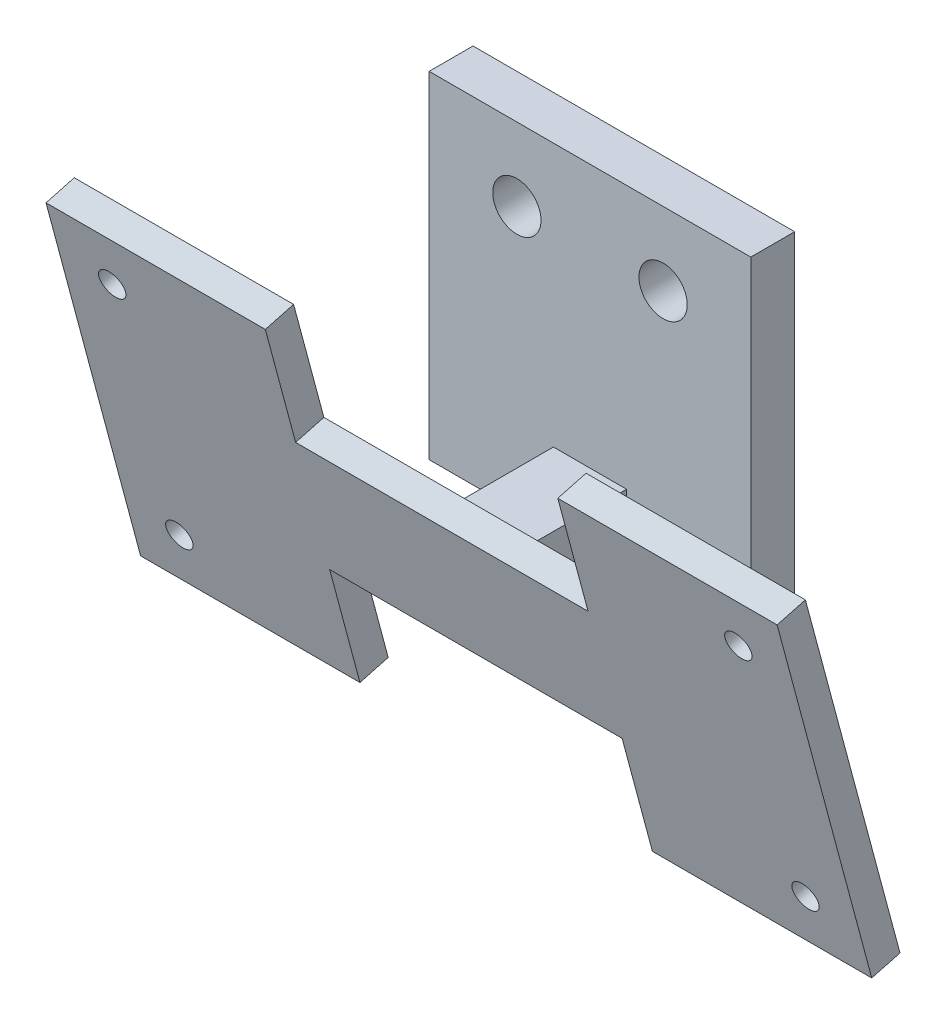
ISO-10303-21;
HEADER;
FILE_DESCRIPTION(('STEP AP214'),'2;1');
FILE_NAME('part.step','',(''),(''),'','','');
FILE_SCHEMA(('AUTOMOTIVE_DESIGN { 1 0 10303 214 1 1 1 1 }'));
ENDSEC;
DATA;
#1=APPLICATION_CONTEXT('core data for automotive mechanical design processes');
#2=APPLICATION_PROTOCOL_DEFINITION('international standard','automotive_design',2000,#1);
#3=PRODUCT_CONTEXT('',#1,'mechanical');
#4=PRODUCT('Part','Part','',(#3));
#5=PRODUCT_RELATED_PRODUCT_CATEGORY('part','',(#4));
#6=PRODUCT_DEFINITION_FORMATION('','',#4);
#7=PRODUCT_DEFINITION_CONTEXT('part definition',#1,'design');
#8=PRODUCT_DEFINITION('design','',#6,#7);
#9=PRODUCT_DEFINITION_SHAPE('','',#8);
#10=(LENGTH_UNIT() NAMED_UNIT(*) SI_UNIT(.MILLI.,.METRE.));
#11=(NAMED_UNIT(*) PLANE_ANGLE_UNIT() SI_UNIT($,.RADIAN.));
#12=(NAMED_UNIT(*) SI_UNIT($,.STERADIAN.) SOLID_ANGLE_UNIT());
#13=UNCERTAINTY_MEASURE_WITH_UNIT(LENGTH_MEASURE(1.E-05),#10,'distance_accuracy_value','');
#14=(GEOMETRIC_REPRESENTATION_CONTEXT(3) GLOBAL_UNCERTAINTY_ASSIGNED_CONTEXT((#13)) GLOBAL_UNIT_ASSIGNED_CONTEXT((#10,
#11,#12)) REPRESENTATION_CONTEXT('',''));
#15=CARTESIAN_POINT('',(0.,0.,0.));
#16=DIRECTION('',(0.,0.,1.));
#17=DIRECTION('',(1.,0.,0.));
#18=AXIS2_PLACEMENT_3D('',#15,#16,#17);
#19=CARTESIAN_POINT('',(-25.,-27.3152537835109,6.7988361099295));
#20=DIRECTION('',(0.,0.96592582628907,0.258819045102513));
#21=DIRECTION('',(0.,-0.258819045102513,0.965925826289071));
#22=AXIS2_PLACEMENT_3D('',#19,#20,#21);
#23=PLANE('',#22);
#24=DIRECTION('',(1.,0.,0.));
#25=VECTOR('',#24,1.);
#26=CARTESIAN_POINT('',(-25.,-27.3152537835109,6.7988361099295));
#27=LINE('',#26,#25);
#28=CARTESIAN_POINT('',(-25.,-27.3152537835109,6.7988361099295));
#29=VERTEX_POINT('',#28);
#30=CARTESIAN_POINT('',(-10.,-27.3152537835109,6.7988361099295));
#31=VERTEX_POINT('',#30);
#32=EDGE_CURVE('E202',#29,#31,#27,.T.);
#33=ORIENTED_EDGE('',*,*,#32,.T.);
#34=DIRECTION('',(0.,-0.258819045102515,0.96592582628907));
#35=VECTOR('',#34,1.);
#36=CARTESIAN_POINT('',(-10.,-26.5387966482033,3.90105863106228));
#37=LINE('',#36,#35);
#38=CARTESIAN_POINT('',(-10.,-27.8328918737159,8.73068776250763));
#39=VERTEX_POINT('',#38);
#40=EDGE_CURVE('E185',#31,#39,#37,.T.);
#41=ORIENTED_EDGE('',*,*,#40,.T.);
#42=DIRECTION('',(1.,0.,0.));
#43=VECTOR('',#42,1.);
#44=CARTESIAN_POINT('',(-25.,-27.8328918737159,8.73068776250763));
#45=LINE('',#44,#43);
#46=CARTESIAN_POINT('',(-25.,-27.8328918737159,8.73068776250763));
#47=VERTEX_POINT('',#46);
#48=EDGE_CURVE('E200',#47,#39,#45,.T.);
#49=ORIENTED_EDGE('',*,*,#48,.F.);
#50=DIRECTION('',(0.,-0.258819045102513,0.96592582628907));
#51=VECTOR('',#50,1.);
#52=CARTESIAN_POINT('',(-25.,-27.3152537835109,6.7988361099295));
#53=LINE('',#52,#51);
#54=EDGE_CURVE('E405',#29,#47,#53,.T.);
#55=ORIENTED_EDGE('',*,*,#54,.F.);
#56=EDGE_LOOP('',(#33,#41,#49,#55));
#57=FACE_BOUND('',#56,.T.);
#58=ADVANCED_FACE('F45',(#57),#23,.F.);
#59=CARTESIAN_POINT('',(-25.,-3.1671081262841,13.2693122374924));
#60=DIRECTION('',(0.,-0.96592582628907,-0.258819045102515));
#61=DIRECTION('',(0.,0.258819045102515,-0.96592582628907));
#62=AXIS2_PLACEMENT_3D('',#59,#60,#61);
#63=PLANE('',#62);
#64=DIRECTION('',(1.,0.,0.));
#65=VECTOR('',#64,1.);
#66=CARTESIAN_POINT('',(-25.,-3.68474621648913,15.2011638900705));
#67=LINE('',#66,#65);
#68=CARTESIAN_POINT('',(-25.,-3.68474621648913,15.2011638900705));
#69=VERTEX_POINT('',#68);
#70=CARTESIAN_POINT('',(-10.,-3.68474621648913,15.2011638900705));
#71=VERTEX_POINT('',#70);
#72=EDGE_CURVE('E220',#69,#71,#67,.T.);
#73=ORIENTED_EDGE('',*,*,#72,.T.);
#74=DIRECTION('',(0.,-0.258819045102515,0.96592582628907));
#75=VECTOR('',#74,1.);
#76=CARTESIAN_POINT('',(-10.,-2.39065099097656,10.3715347586252));
#77=LINE('',#76,#75);
#78=CARTESIAN_POINT('',(-10.,-3.1671081262841,13.2693122374924));
#79=VERTEX_POINT('',#78);
#80=EDGE_CURVE('E380',#79,#71,#77,.T.);
#81=ORIENTED_EDGE('',*,*,#80,.F.);
#82=DIRECTION('',(1.,0.,0.));
#83=VECTOR('',#82,1.);
#84=CARTESIAN_POINT('',(-25.,-3.1671081262841,13.2693122374924));
#85=LINE('',#84,#83);
#86=CARTESIAN_POINT('',(-25.,-3.1671081262841,13.2693122374924));
#87=VERTEX_POINT('',#86);
#88=EDGE_CURVE('E434',#87,#79,#85,.T.);
#89=ORIENTED_EDGE('',*,*,#88,.F.);
#90=DIRECTION('',(0.,0.258819045102515,-0.96592582628907));
#91=VECTOR('',#90,1.);
#92=CARTESIAN_POINT('',(-25.,-3.1671081262841,13.2693122374924));
#93=LINE('',#92,#91);
#94=EDGE_CURVE('E411',#69,#87,#93,.T.);
#95=ORIENTED_EDGE('',*,*,#94,.F.);
#96=EDGE_LOOP('',(#73,#81,#89,#95));
#97=FACE_BOUND('',#96,.T.);
#98=ADVANCED_FACE('F475',(#97),#63,.F.);
#99=CARTESIAN_POINT('',(0.,-18.,0.));
#100=DIRECTION('',(0.,-1.,0.));
#101=DIRECTION('',(0.,0.,-1.));
#102=AXIS2_PLACEMENT_3D('',#99,#100,#101);
#103=PLANE('',#102);
#104=DIRECTION('',(0.,0.,-1.));
#105=VECTOR('',#104,1.);
#106=CARTESIAN_POINT('',(2.5,-18.,11.));
#107=LINE('',#106,#105);
#108=CARTESIAN_POINT('',(2.5,-18.,9.29485083851213));
#109=VERTEX_POINT('',#108);
#110=CARTESIAN_POINT('',(2.5,-18.,3.));
#111=VERTEX_POINT('',#110);
#112=EDGE_CURVE('E243',#109,#111,#107,.T.);
#113=ORIENTED_EDGE('',*,*,#112,.F.);
#114=DIRECTION('',(-1.,0.,0.));
#115=VECTOR('',#114,1.);
#116=CARTESIAN_POINT('',(0.,-18.,9.29485083851213));
#117=LINE('',#116,#115);
#118=CARTESIAN_POINT('',(-2.5,-18.,9.29485083851213));
#119=VERTEX_POINT('',#118);
#120=EDGE_CURVE('E227',#109,#119,#117,.T.);
#121=ORIENTED_EDGE('',*,*,#120,.T.);
#122=DIRECTION('',(0.,0.,-1.));
#123=VECTOR('',#122,1.);
#124=CARTESIAN_POINT('',(-2.5,-18.,11.));
#125=LINE('',#124,#123);
#126=CARTESIAN_POINT('',(-2.5,-18.,3.));
#127=VERTEX_POINT('',#126);
#128=EDGE_CURVE('E246',#119,#127,#125,.T.);
#129=ORIENTED_EDGE('',*,*,#128,.T.);
#130=DIRECTION('',(-1.,0.,0.));
#131=VECTOR('',#130,1.);
#132=CARTESIAN_POINT('',(-11.,-18.,3.));
#133=LINE('',#132,#131);
#134=CARTESIAN_POINT('',(-11.,-18.,3.));
#135=VERTEX_POINT('',#134);
#136=EDGE_CURVE('E267',#127,#135,#133,.T.);
#137=ORIENTED_EDGE('',*,*,#136,.T.);
#138=DIRECTION('',(0.,0.,-1.));
#139=VECTOR('',#138,1.);
#140=CARTESIAN_POINT('',(-11.,-18.,3.));
#141=LINE('',#140,#139);
#142=CARTESIAN_POINT('',(-11.,-18.,0.));
#143=VERTEX_POINT('',#142);
#144=EDGE_CURVE('E255',#135,#143,#141,.T.);
#145=ORIENTED_EDGE('',*,*,#144,.T.);
#146=DIRECTION('',(1.,0.,0.));
#147=VECTOR('',#146,1.);
#148=CARTESIAN_POINT('',(-11.,-18.,0.));
#149=LINE('',#148,#147);
#150=CARTESIAN_POINT('',(11.,-18.,0.));
#151=VERTEX_POINT('',#150);
#152=EDGE_CURVE('E259',#143,#151,#149,.T.);
#153=ORIENTED_EDGE('',*,*,#152,.T.);
#154=DIRECTION('',(0.,0.,1.));
#155=VECTOR('',#154,1.);
#156=CARTESIAN_POINT('',(11.,-18.,3.));
#157=LINE('',#156,#155);
#158=CARTESIAN_POINT('',(11.,-18.,3.));
#159=VERTEX_POINT('',#158);
#160=EDGE_CURVE('E263',#151,#159,#157,.T.);
#161=ORIENTED_EDGE('',*,*,#160,.T.);
#162=EDGE_CURVE('E268',#159,#111,#133,.T.);
#163=ORIENTED_EDGE('',*,*,#162,.T.);
#164=EDGE_LOOP('',(#113,#121,#129,#137,#145,#153,#161,#163));
#165=FACE_BOUND('',#164,.T.);
#166=ADVANCED_FACE('F497',(#165),#103,.T.);
#167=CARTESIAN_POINT('',(2.5,-13.,11.));
#168=DIRECTION('',(-1.,0.,0.));
#169=DIRECTION('',(0.,-1.,0.));
#170=AXIS2_PLACEMENT_3D('',#167,#168,#169);
#171=PLANE('',#170);
#172=DIRECTION('',(0.,0.96592582628907,0.258819045102515));
#173=VECTOR('',#172,1.);
#174=CARTESIAN_POINT('',(2.5,-12.9086492001669,10.6590741737109));
#175=LINE('',#174,#173);
#176=CARTESIAN_POINT('',(2.5,-13.,10.6345968006677));
#177=VERTEX_POINT('',#176);
#178=EDGE_CURVE('E218',#109,#177,#175,.T.);
#179=ORIENTED_EDGE('',*,*,#178,.F.);
#180=ORIENTED_EDGE('',*,*,#112,.T.);
#181=DIRECTION('',(0.,1.,0.));
#182=VECTOR('',#181,1.);
#183=CARTESIAN_POINT('',(2.5,-13.,3.));
#184=LINE('',#183,#182);
#185=CARTESIAN_POINT('',(2.5,-13.,3.));
#186=VERTEX_POINT('',#185);
#187=EDGE_CURVE('E231',#111,#186,#184,.T.);
#188=ORIENTED_EDGE('',*,*,#187,.T.);
#189=DIRECTION('',(0.,0.,-1.));
#190=VECTOR('',#189,1.);
#191=CARTESIAN_POINT('',(2.5,-13.,11.));
#192=LINE('',#191,#190);
#193=EDGE_CURVE('E252',#177,#186,#192,.T.);
#194=ORIENTED_EDGE('',*,*,#193,.F.);
#195=EDGE_LOOP('',(#179,#180,#188,#194));
#196=FACE_BOUND('',#195,.T.);
#197=ADVANCED_FACE('F565',(#196),#171,.F.);
#198=CARTESIAN_POINT('',(-2.5,-13.,11.));
#199=DIRECTION('',(0.,-1.,0.));
#200=DIRECTION('',(0.,0.,-1.));
#201=AXIS2_PLACEMENT_3D('',#198,#199,#200);
#202=PLANE('',#201);
#203=DIRECTION('',(-1.,0.,0.));
#204=VECTOR('',#203,1.);
#205=CARTESIAN_POINT('',(-2.5,-13.,10.6345968006677));
#206=LINE('',#205,#204);
#207=CARTESIAN_POINT('',(-2.5,-13.,10.6345968006677));
#208=VERTEX_POINT('',#207);
#209=EDGE_CURVE('E212',#177,#208,#206,.T.);
#210=ORIENTED_EDGE('',*,*,#209,.F.);
#211=ORIENTED_EDGE('',*,*,#193,.T.);
#212=DIRECTION('',(-1.,0.,0.));
#213=VECTOR('',#212,1.);
#214=CARTESIAN_POINT('',(-2.5,-13.,3.));
#215=LINE('',#214,#213);
#216=CARTESIAN_POINT('',(-2.5,-13.,3.));
#217=VERTEX_POINT('',#216);
#218=EDGE_CURVE('E235',#186,#217,#215,.T.);
#219=ORIENTED_EDGE('',*,*,#218,.T.);
#220=DIRECTION('',(0.,0.,-1.));
#221=VECTOR('',#220,1.);
#222=CARTESIAN_POINT('',(-2.5,-13.,11.));
#223=LINE('',#222,#221);
#224=EDGE_CURVE('E249',#208,#217,#223,.T.);
#225=ORIENTED_EDGE('',*,*,#224,.F.);
#226=EDGE_LOOP('',(#210,#211,#219,#225));
#227=FACE_BOUND('',#226,.T.);
#228=ADVANCED_FACE('F562',(#227),#202,.F.);
#229=CARTESIAN_POINT('',(-2.5,-13.,11.));
#230=DIRECTION('',(1.,0.,0.));
#231=DIRECTION('',(0.,0.,-1.));
#232=AXIS2_PLACEMENT_3D('',#229,#230,#231);
#233=PLANE('',#232);
#234=DIRECTION('',(0.,-0.96592582628907,-0.258819045102515));
#235=VECTOR('',#234,1.);
#236=CARTESIAN_POINT('',(-2.5,-12.9086492001669,10.6590741737109));
#237=LINE('',#236,#235);
#238=EDGE_CURVE('E317',#208,#119,#237,.T.);
#239=ORIENTED_EDGE('',*,*,#238,.F.);
#240=ORIENTED_EDGE('',*,*,#224,.T.);
#241=DIRECTION('',(0.,-1.,0.));
#242=VECTOR('',#241,1.);
#243=CARTESIAN_POINT('',(-2.5,-13.,3.));
#244=LINE('',#243,#242);
#245=EDGE_CURVE('E239',#217,#127,#244,.T.);
#246=ORIENTED_EDGE('',*,*,#245,.T.);
#247=ORIENTED_EDGE('',*,*,#128,.F.);
#248=EDGE_LOOP('',(#239,#240,#246,#247));
#249=FACE_BOUND('',#248,.T.);
#250=ADVANCED_FACE('F526',(#249),#233,.F.);
#251=CARTESIAN_POINT('',(0.,0.,3.));
#252=DIRECTION('',(0.,0.,-1.));
#253=DIRECTION('',(-1.,0.,0.));
#254=AXIS2_PLACEMENT_3D('',#251,#252,#253);
#255=PLANE('',#254);
#256=CARTESIAN_POINT('',(5.,0.,3.));
#257=DIRECTION('',(0.,0.,1.));
#258=DIRECTION('',(-1.,0.,0.));
#259=AXIS2_PLACEMENT_3D('',#256,#257,#258);
#260=CIRCLE('',#259,1.65);
#261=CARTESIAN_POINT('',(3.35,0.,3.));
#262=VERTEX_POINT('',#261);
#263=EDGE_CURVE('E273',#262,#262,#260,.T.);
#264=ORIENTED_EDGE('',*,*,#263,.F.);
#265=EDGE_LOOP('',(#264));
#266=FACE_BOUND('',#265,.T.);
#267=CARTESIAN_POINT('',(-5.,0.,3.));
#268=DIRECTION('',(0.,0.,1.));
#269=DIRECTION('',(1.,0.,0.));
#270=AXIS2_PLACEMENT_3D('',#267,#268,#269);
#271=CIRCLE('',#270,1.65);
#272=CARTESIAN_POINT('',(-3.35,0.,3.));
#273=VERTEX_POINT('',#272);
#274=EDGE_CURVE('E281',#273,#273,#271,.T.);
#275=ORIENTED_EDGE('',*,*,#274,.F.);
#276=EDGE_LOOP('',(#275));
#277=FACE_BOUND('',#276,.T.);
#278=ORIENTED_EDGE('',*,*,#187,.F.);
#279=ORIENTED_EDGE('',*,*,#162,.F.);
#280=DIRECTION('',(0.,1.,0.));
#281=VECTOR('',#280,1.);
#282=CARTESIAN_POINT('',(11.,-5.,3.));
#283=LINE('',#282,#281);
#284=CARTESIAN_POINT('',(11.,5.,3.));
#285=VERTEX_POINT('',#284);
#286=EDGE_CURVE('E289',#159,#285,#283,.T.);
#287=ORIENTED_EDGE('',*,*,#286,.T.);
#288=DIRECTION('',(-1.,0.,0.));
#289=VECTOR('',#288,1.);
#290=CARTESIAN_POINT('',(-11.,5.,3.));
#291=LINE('',#290,#289);
#292=CARTESIAN_POINT('',(-11.,5.,3.));
#293=VERTEX_POINT('',#292);
#294=EDGE_CURVE('E293',#285,#293,#291,.T.);
#295=ORIENTED_EDGE('',*,*,#294,.T.);
#296=DIRECTION('',(0.,-1.,0.));
#297=VECTOR('',#296,1.);
#298=CARTESIAN_POINT('',(-11.,-5.,3.));
#299=LINE('',#298,#297);
#300=EDGE_CURVE('E297',#293,#135,#299,.T.);
#301=ORIENTED_EDGE('',*,*,#300,.T.);
#302=ORIENTED_EDGE('',*,*,#136,.F.);
#303=ORIENTED_EDGE('',*,*,#245,.F.);
#304=ORIENTED_EDGE('',*,*,#218,.F.);
#305=EDGE_LOOP('',(#278,#279,#287,#295,#301,#302,#303,#304));
#306=FACE_BOUND('',#305,.T.);
#307=ADVANCED_FACE('F522',(#266,#277,#306),#255,.F.);
#308=CARTESIAN_POINT('',(0.,0.,0.));
#309=DIRECTION('',(0.,0.,-1.));
#310=DIRECTION('',(-1.,0.,0.));
#311=AXIS2_PLACEMENT_3D('',#308,#309,#310);
#312=PLANE('',#311);
#313=CARTESIAN_POINT('',(-5.,0.,0.));
#314=DIRECTION('',(0.,0.,1.));
#315=DIRECTION('',(1.,0.,0.));
#316=AXIS2_PLACEMENT_3D('',#313,#314,#315);
#317=CIRCLE('',#316,1.65);
#318=CARTESIAN_POINT('',(-3.35,0.,0.));
#319=VERTEX_POINT('',#318);
#320=EDGE_CURVE('E277',#319,#319,#317,.T.);
#321=ORIENTED_EDGE('',*,*,#320,.T.);
#322=EDGE_LOOP('',(#321));
#323=FACE_BOUND('',#322,.T.);
#324=DIRECTION('',(0.,1.,0.));
#325=VECTOR('',#324,1.);
#326=CARTESIAN_POINT('',(11.,-5.,0.));
#327=LINE('',#326,#325);
#328=CARTESIAN_POINT('',(11.,5.,0.));
#329=VERTEX_POINT('',#328);
#330=EDGE_CURVE('E285',#151,#329,#327,.T.);
#331=ORIENTED_EDGE('',*,*,#330,.F.);
#332=ORIENTED_EDGE('',*,*,#152,.F.);
#333=DIRECTION('',(0.,-1.,0.));
#334=VECTOR('',#333,1.);
#335=CARTESIAN_POINT('',(-11.,-5.,0.));
#336=LINE('',#335,#334);
#337=CARTESIAN_POINT('',(-11.,5.,0.));
#338=VERTEX_POINT('',#337);
#339=EDGE_CURVE('E294',#338,#143,#336,.T.);
#340=ORIENTED_EDGE('',*,*,#339,.F.);
#341=DIRECTION('',(-1.,0.,0.));
#342=VECTOR('',#341,1.);
#343=CARTESIAN_POINT('',(-11.,5.,0.));
#344=LINE('',#343,#342);
#345=EDGE_CURVE('E305',#329,#338,#344,.T.);
#346=ORIENTED_EDGE('',*,*,#345,.F.);
#347=EDGE_LOOP('',(#331,#332,#340,#346));
#348=FACE_BOUND('',#347,.T.);
#349=CARTESIAN_POINT('',(5.,0.,0.));
#350=DIRECTION('',(0.,0.,1.));
#351=DIRECTION('',(-1.,0.,0.));
#352=AXIS2_PLACEMENT_3D('',#349,#350,#351);
#353=CIRCLE('',#352,1.65);
#354=CARTESIAN_POINT('',(3.35,0.,0.));
#355=VERTEX_POINT('',#354);
#356=EDGE_CURVE('E272',#355,#355,#353,.T.);
#357=ORIENTED_EDGE('',*,*,#356,.T.);
#358=EDGE_LOOP('',(#357));
#359=FACE_BOUND('',#358,.T.);
#360=ADVANCED_FACE('F525',(#323,#348,#359),#312,.T.);
#361=CARTESIAN_POINT('',(11.,-5.,3.));
#362=DIRECTION('',(-1.,0.,0.));
#363=DIRECTION('',(0.,0.,1.));
#364=AXIS2_PLACEMENT_3D('',#361,#362,#363);
#365=PLANE('',#364);
#366=ORIENTED_EDGE('',*,*,#330,.T.);
#367=DIRECTION('',(0.,0.,-1.));
#368=VECTOR('',#367,1.);
#369=CARTESIAN_POINT('',(11.,5.,3.));
#370=LINE('',#369,#368);
#371=EDGE_CURVE('E313',#285,#329,#370,.T.);
#372=ORIENTED_EDGE('',*,*,#371,.F.);
#373=ORIENTED_EDGE('',*,*,#286,.F.);
#374=ORIENTED_EDGE('',*,*,#160,.F.);
#375=EDGE_LOOP('',(#366,#372,#373,#374));
#376=FACE_BOUND('',#375,.T.);
#377=ADVANCED_FACE('F47',(#376),#365,.F.);
#378=CARTESIAN_POINT('',(-11.,5.,3.));
#379=DIRECTION('',(0.,-1.,0.));
#380=DIRECTION('',(0.,0.,-1.));
#381=AXIS2_PLACEMENT_3D('',#378,#379,#380);
#382=PLANE('',#381);
#383=ORIENTED_EDGE('',*,*,#345,.T.);
#384=DIRECTION('',(0.,0.,-1.));
#385=VECTOR('',#384,1.);
#386=CARTESIAN_POINT('',(-11.,5.,3.));
#387=LINE('',#386,#385);
#388=EDGE_CURVE('E301',#293,#338,#387,.T.);
#389=ORIENTED_EDGE('',*,*,#388,.F.);
#390=ORIENTED_EDGE('',*,*,#294,.F.);
#391=ORIENTED_EDGE('',*,*,#371,.T.);
#392=EDGE_LOOP('',(#383,#389,#390,#391));
#393=FACE_BOUND('',#392,.T.);
#394=ADVANCED_FACE('F531',(#393),#382,.F.);
#395=CARTESIAN_POINT('',(-11.,-5.,3.));
#396=DIRECTION('',(1.,0.,0.));
#397=DIRECTION('',(0.,0.,-1.));
#398=AXIS2_PLACEMENT_3D('',#395,#396,#397);
#399=PLANE('',#398);
#400=ORIENTED_EDGE('',*,*,#339,.T.);
#401=ORIENTED_EDGE('',*,*,#144,.F.);
#402=ORIENTED_EDGE('',*,*,#300,.F.);
#403=ORIENTED_EDGE('',*,*,#388,.T.);
#404=EDGE_LOOP('',(#400,#401,#402,#403));
#405=FACE_BOUND('',#404,.T.);
#406=ADVANCED_FACE('F515',(#405),#399,.F.);
#407=CARTESIAN_POINT('',(-5.,0.,3.));
#408=DIRECTION('',(0.,0.,-1.));
#409=DIRECTION('',(-1.,0.,0.));
#410=AXIS2_PLACEMENT_3D('',#407,#408,#409);
#411=CYLINDRICAL_SURFACE('',#410,1.65);
#412=ORIENTED_EDGE('',*,*,#274,.T.);
#413=EDGE_LOOP('',(#412));
#414=FACE_BOUND('',#413,.T.);
#415=ORIENTED_EDGE('',*,*,#320,.F.);
#416=EDGE_LOOP('',(#415));
#417=FACE_BOUND('',#416,.T.);
#418=ADVANCED_FACE('F508',(#414,#417),#411,.F.);
#419=CARTESIAN_POINT('',(5.,0.,3.));
#420=DIRECTION('',(0.,0.,-1.));
#421=DIRECTION('',(-1.,0.,0.));
#422=AXIS2_PLACEMENT_3D('',#419,#420,#421);
#423=CYLINDRICAL_SURFACE('',#422,1.65);
#424=ORIENTED_EDGE('',*,*,#263,.T.);
#425=EDGE_LOOP('',(#424));
#426=FACE_BOUND('',#425,.T.);
#427=ORIENTED_EDGE('',*,*,#356,.F.);
#428=EDGE_LOOP('',(#427));
#429=FACE_BOUND('',#428,.T.);
#430=ADVANCED_FACE('F502',(#426,#429),#423,.F.);
#431=CARTESIAN_POINT('',(10.,-27.8328918737159,8.73068776250763));
#432=VERTEX_POINT('',#431);
#433=CARTESIAN_POINT('',(25.,-27.8328918737159,8.73068776250763));
#434=VERTEX_POINT('',#433);
#435=EDGE_CURVE('E213',#432,#434,#45,.T.);
#436=ORIENTED_EDGE('',*,*,#435,.F.);
#437=DIRECTION('',(0.,-0.258819045102515,0.96592582628907));
#438=VECTOR('',#437,1.);
#439=CARTESIAN_POINT('',(10.,-26.5387966482033,3.90105863106228));
#440=LINE('',#439,#438);
#441=CARTESIAN_POINT('',(10.,-27.3152537835109,6.7988361099295));
#442=VERTEX_POINT('',#441);
#443=EDGE_CURVE('E204',#442,#432,#440,.T.);
#444=ORIENTED_EDGE('',*,*,#443,.F.);
#445=CARTESIAN_POINT('',(25.,-27.3152537835109,6.7988361099295));
#446=VERTEX_POINT('',#445);
#447=EDGE_CURVE('E417',#442,#446,#27,.T.);
#448=ORIENTED_EDGE('',*,*,#447,.T.);
#449=DIRECTION('',(0.,-0.258819045102513,0.96592582628907));
#450=VECTOR('',#449,1.);
#451=CARTESIAN_POINT('',(25.,-27.3152537835109,6.7988361099295));
#452=LINE('',#451,#450);
#453=EDGE_CURVE('E339',#446,#434,#452,.T.);
#454=ORIENTED_EDGE('',*,*,#453,.T.);
#455=EDGE_LOOP('',(#436,#444,#448,#454));
#456=FACE_BOUND('',#455,.T.);
#457=ADVANCED_FACE('F454',(#456),#23,.F.);
#458=CARTESIAN_POINT('',(-25.,-27.8328918737159,8.73068776250763));
#459=DIRECTION('',(0.,0.258819045102515,-0.96592582628907));
#460=DIRECTION('',(0.,0.96592582628907,0.258819045102515));
#461=AXIS2_PLACEMENT_3D('',#458,#459,#460);
#462=PLANE('',#461);
#463=CARTESIAN_POINT('',(-21.41,-24.3265811242866,9.67020089622977));
#464=DIRECTION('',(0.,-0.258819045102515,0.96592582628907));
#465=DIRECTION('',(0.,0.96592582628907,0.258819045102515));
#466=AXIS2_PLACEMENT_3D('',#463,#464,#465);
#467=CIRCLE('',#466,0.910000000000001);
#468=CARTESIAN_POINT('',(-21.41,-23.4475886223635,9.90572622727306));
#469=VERTEX_POINT('',#468);
#470=EDGE_CURVE('E361',#469,#469,#467,.T.);
#471=ORIENTED_EDGE('',*,*,#470,.F.);
#472=EDGE_LOOP('',(#471));
#473=FACE_BOUND('',#472,.T.);
#474=CARTESIAN_POINT('',(21.41,-24.3265811242866,9.67020089622977));
#475=DIRECTION('',(0.,-0.258819045102515,0.96592582628907));
#476=DIRECTION('',(0.,-0.96592582628907,-0.258819045102515));
#477=AXIS2_PLACEMENT_3D('',#474,#475,#476);
#478=CIRCLE('',#477,0.91);
#479=CARTESIAN_POINT('',(21.41,-25.2055736262096,9.43467556518648));
#480=VERTEX_POINT('',#479);
#481=EDGE_CURVE('E366',#480,#480,#478,.T.);
#482=ORIENTED_EDGE('',*,*,#481,.F.);
#483=EDGE_LOOP('',(#482));
#484=FACE_BOUND('',#483,.T.);
#485=CARTESIAN_POINT('',(21.41,-7.19105696591845,14.2616507563484));
#486=DIRECTION('',(0.,-0.258819045102515,0.96592582628907));
#487=DIRECTION('',(0.,0.96592582628907,0.258819045102515));
#488=AXIS2_PLACEMENT_3D('',#485,#486,#487);
#489=CIRCLE('',#488,0.91);
#490=CARTESIAN_POINT('',(21.41,-6.3120644639954,14.4971760873917));
#491=VERTEX_POINT('',#490);
#492=EDGE_CURVE('E395',#491,#491,#489,.T.);
#493=ORIENTED_EDGE('',*,*,#492,.F.);
#494=EDGE_LOOP('',(#493));
#495=FACE_BOUND('',#494,.T.);
#496=CARTESIAN_POINT('',(-21.41,-7.19105696591845,14.2616507563484));
#497=DIRECTION('',(0.,-0.258819045102515,0.96592582628907));
#498=DIRECTION('',(0.,-0.96592582628907,-0.258819045102515));
#499=AXIS2_PLACEMENT_3D('',#496,#497,#498);
#500=CIRCLE('',#499,0.91);
#501=CARTESIAN_POINT('',(-21.41,-8.07004946784151,14.0261254253051));
#502=VERTEX_POINT('',#501);
#503=EDGE_CURVE('E327',#502,#502,#500,.T.);
#504=ORIENTED_EDGE('',*,*,#503,.F.);
#505=EDGE_LOOP('',(#504));
#506=FACE_BOUND('',#505,.T.);
#507=ORIENTED_EDGE('',*,*,#48,.T.);
#508=DIRECTION('',(0.,-0.96592582628907,-0.258819045102515));
#509=VECTOR('',#508,1.);
#510=CARTESIAN_POINT('',(-10.,-20.1054852634033,10.8012401233278));
#511=LINE('',#510,#509);
#512=CARTESIAN_POINT('',(-10.,-20.1054852634033,10.8012401233278));
#513=VERTEX_POINT('',#512);
#514=EDGE_CURVE('E182',#513,#39,#511,.T.);
#515=ORIENTED_EDGE('',*,*,#514,.F.);
#516=DIRECTION('',(-1.,0.,0.));
#517=VECTOR('',#516,1.);
#518=CARTESIAN_POINT('',(-10.,-20.1054852634033,10.8012401233278));
#519=LINE('',#518,#517);
#520=CARTESIAN_POINT('',(10.,-20.1054852634033,10.8012401233278));
#521=VERTEX_POINT('',#520);
#522=EDGE_CURVE('E205',#521,#513,#519,.T.);
#523=ORIENTED_EDGE('',*,*,#522,.F.);
#524=DIRECTION('',(0.,0.96592582628907,0.258819045102515));
#525=VECTOR('',#524,1.);
#526=CARTESIAN_POINT('',(10.,-20.1054852634033,10.8012401233278));
#527=LINE('',#526,#525);
#528=EDGE_CURVE('E193',#432,#521,#527,.T.);
#529=ORIENTED_EDGE('',*,*,#528,.F.);
#530=ORIENTED_EDGE('',*,*,#435,.T.);
#531=DIRECTION('',(0.,0.96592582628907,0.258819045102515));
#532=VECTOR('',#531,1.);
#533=CARTESIAN_POINT('',(25.,-27.8328918737159,8.73068776250763));
#534=LINE('',#533,#532);
#535=CARTESIAN_POINT('',(25.,-3.68474621648913,15.2011638900705));
#536=VERTEX_POINT('',#535);
#537=EDGE_CURVE('E421',#434,#536,#534,.T.);
#538=ORIENTED_EDGE('',*,*,#537,.T.);
#539=CARTESIAN_POINT('',(10.,-3.68474621648913,15.2011638900705));
#540=VERTEX_POINT('',#539);
#541=EDGE_CURVE('E437',#540,#536,#67,.T.);
#542=ORIENTED_EDGE('',*,*,#541,.F.);
#543=DIRECTION('',(0.,0.96592582628907,0.258819045102515));
#544=VECTOR('',#543,1.);
#545=CARTESIAN_POINT('',(10.,-11.4121528268017,13.1306115292504));
#546=LINE('',#545,#544);
#547=CARTESIAN_POINT('',(10.,-11.4121528268017,13.1306115292504));
#548=VERTEX_POINT('',#547);
#549=EDGE_CURVE('E389',#548,#540,#546,.T.);
#550=ORIENTED_EDGE('',*,*,#549,.F.);
#551=DIRECTION('',(1.,0.,0.));
#552=VECTOR('',#551,1.);
#553=CARTESIAN_POINT('',(-10.,-11.4121528268017,13.1306115292504));
#554=LINE('',#553,#552);
#555=CARTESIAN_POINT('',(-10.,-11.4121528268017,13.1306115292504));
#556=VERTEX_POINT('',#555);
#557=EDGE_CURVE('E194',#556,#548,#554,.T.);
#558=ORIENTED_EDGE('',*,*,#557,.F.);
#559=DIRECTION('',(0.,-0.96592582628907,-0.258819045102515));
#560=VECTOR('',#559,1.);
#561=CARTESIAN_POINT('',(-10.,-11.4121528268017,13.1306115292504));
#562=LINE('',#561,#560);
#563=EDGE_CURVE('E377',#71,#556,#562,.T.);
#564=ORIENTED_EDGE('',*,*,#563,.F.);
#565=ORIENTED_EDGE('',*,*,#72,.F.);
#566=DIRECTION('',(0.,0.96592582628907,0.258819045102515));
#567=VECTOR('',#566,1.);
#568=CARTESIAN_POINT('',(-25.,-27.8328918737159,8.73068776250763));
#569=LINE('',#568,#567);
#570=EDGE_CURVE('E209',#47,#69,#569,.T.);
#571=ORIENTED_EDGE('',*,*,#570,.F.);
#572=EDGE_LOOP('',(#507,#515,#523,#529,#530,#538,#542,#550,#558,#564,#565,#571));
#573=FACE_BOUND('',#572,.T.);
#574=ADVANCED_FACE('F207',(#473,#484,#495,#506,#573),#462,.F.);
#575=CARTESIAN_POINT('',(10.,-3.1671081262841,13.2693122374924));
#576=VERTEX_POINT('',#575);
#577=CARTESIAN_POINT('',(25.,-3.1671081262841,13.2693122374924));
#578=VERTEX_POINT('',#577);
#579=EDGE_CURVE('E433',#576,#578,#85,.T.);
#580=ORIENTED_EDGE('',*,*,#579,.F.);
#581=DIRECTION('',(0.,-0.258819045102515,0.96592582628907));
#582=VECTOR('',#581,1.);
#583=CARTESIAN_POINT('',(10.,-2.39065099097656,10.3715347586252));
#584=LINE('',#583,#582);
#585=EDGE_CURVE('E69',#576,#540,#584,.T.);
#586=ORIENTED_EDGE('',*,*,#585,.T.);
#587=ORIENTED_EDGE('',*,*,#541,.T.);
#588=DIRECTION('',(0.,0.258819045102515,-0.96592582628907));
#589=VECTOR('',#588,1.);
#590=CARTESIAN_POINT('',(25.,-3.1671081262841,13.2693122374924));
#591=LINE('',#590,#589);
#592=EDGE_CURVE('E425',#536,#578,#591,.T.);
#593=ORIENTED_EDGE('',*,*,#592,.T.);
#594=EDGE_LOOP('',(#580,#586,#587,#593));
#595=FACE_BOUND('',#594,.T.);
#596=ADVANCED_FACE('F447',(#595),#63,.F.);
#597=CARTESIAN_POINT('',(-25.,-27.3152537835109,6.7988361099295));
#598=DIRECTION('',(0.,-0.258819045102515,0.96592582628907));
#599=DIRECTION('',(0.,-0.96592582628907,-0.258819045102515));
#600=AXIS2_PLACEMENT_3D('',#597,#598,#599);
#601=PLANE('',#600);
#602=CARTESIAN_POINT('',(-21.41,-23.8089430340815,7.73834924365163));
#603=DIRECTION('',(0.,-0.258819045102515,0.96592582628907));
#604=DIRECTION('',(0.,-0.96592582628907,-0.258819045102515));
#605=AXIS2_PLACEMENT_3D('',#602,#603,#604);
#606=CIRCLE('',#605,0.910000000000001);
#607=CARTESIAN_POINT('',(-21.41,-24.6879355360046,7.50282391260834));
#608=VERTEX_POINT('',#607);
#609=EDGE_CURVE('E335',#608,#608,#606,.T.);
#610=ORIENTED_EDGE('',*,*,#609,.T.);
#611=EDGE_LOOP('',(#610));
#612=FACE_BOUND('',#611,.T.);
#613=CARTESIAN_POINT('',(21.41,-23.8089430340815,7.73834924365163));
#614=DIRECTION('',(0.,-0.258819045102515,0.96592582628907));
#615=DIRECTION('',(0.,-0.96592582628907,-0.258819045102515));
#616=AXIS2_PLACEMENT_3D('',#613,#614,#615);
#617=CIRCLE('',#616,0.91);
#618=CARTESIAN_POINT('',(21.41,-24.6879355360046,7.50282391260834));
#619=VERTEX_POINT('',#618);
#620=EDGE_CURVE('E331',#619,#619,#617,.T.);
#621=ORIENTED_EDGE('',*,*,#620,.T.);
#622=EDGE_LOOP('',(#621));
#623=FACE_BOUND('',#622,.T.);
#624=CARTESIAN_POINT('',(21.41,-6.67341887571342,12.3297991037702));
#625=DIRECTION('',(0.,-0.258819045102515,0.96592582628907));
#626=DIRECTION('',(0.,-0.96592582628907,-0.258819045102515));
#627=AXIS2_PLACEMENT_3D('',#624,#625,#626);
#628=CIRCLE('',#627,0.91);
#629=CARTESIAN_POINT('',(21.41,-7.55241137763648,12.0942737727269));
#630=VERTEX_POINT('',#629);
#631=EDGE_CURVE('E326',#630,#630,#628,.T.);
#632=ORIENTED_EDGE('',*,*,#631,.T.);
#633=EDGE_LOOP('',(#632));
#634=FACE_BOUND('',#633,.T.);
#635=CARTESIAN_POINT('',(-21.41,-6.67341887571342,12.3297991037702));
#636=DIRECTION('',(0.,-0.258819045102515,0.96592582628907));
#637=DIRECTION('',(0.,-0.96592582628907,-0.258819045102515));
#638=AXIS2_PLACEMENT_3D('',#635,#636,#637);
#639=CIRCLE('',#638,0.91);
#640=CARTESIAN_POINT('',(-21.41,-7.55241137763648,12.094273772727));
#641=VERTEX_POINT('',#640);
#642=EDGE_CURVE('E322',#641,#641,#639,.T.);
#643=ORIENTED_EDGE('',*,*,#642,.T.);
#644=EDGE_LOOP('',(#643));
#645=FACE_BOUND('',#644,.T.);
#646=ORIENTED_EDGE('',*,*,#120,.F.);
#647=ORIENTED_EDGE('',*,*,#178,.T.);
#648=ORIENTED_EDGE('',*,*,#209,.T.);
#649=ORIENTED_EDGE('',*,*,#238,.T.);
#650=EDGE_LOOP('',(#646,#647,#648,#649));
#651=FACE_BOUND('',#650,.T.);
#652=DIRECTION('',(-1.,0.,0.));
#653=VECTOR('',#652,1.);
#654=CARTESIAN_POINT('',(-25.,-19.5878471731983,8.86938847074962));
#655=LINE('',#654,#653);
#656=CARTESIAN_POINT('',(10.,-19.5878471731983,8.86938847074962));
#657=VERTEX_POINT('',#656);
#658=CARTESIAN_POINT('',(-10.,-19.5878471731983,8.86938847074962));
#659=VERTEX_POINT('',#658);
#660=EDGE_CURVE('E54',#657,#659,#655,.T.);
#661=ORIENTED_EDGE('',*,*,#660,.T.);
#662=DIRECTION('',(0.,-0.96592582628907,-0.258819045102515));
#663=VECTOR('',#662,1.);
#664=CARTESIAN_POINT('',(-10.,-27.3152537835109,6.7988361099295));
#665=LINE('',#664,#663);
#666=EDGE_CURVE('E11',#659,#31,#665,.T.);
#667=ORIENTED_EDGE('',*,*,#666,.T.);
#668=ORIENTED_EDGE('',*,*,#32,.F.);
#669=DIRECTION('',(0.,-0.96592582628907,-0.258819045102515));
#670=VECTOR('',#669,1.);
#671=CARTESIAN_POINT('',(-25.,-27.3152537835109,6.7988361099295));
#672=LINE('',#671,#670);
#673=EDGE_CURVE('E414',#87,#29,#672,.T.);
#674=ORIENTED_EDGE('',*,*,#673,.F.);
#675=ORIENTED_EDGE('',*,*,#88,.T.);
#676=DIRECTION('',(0.,-0.96592582628907,-0.258819045102515));
#677=VECTOR('',#676,1.);
#678=CARTESIAN_POINT('',(-10.,-27.3152537835109,6.7988361099295));
#679=LINE('',#678,#677);
#680=CARTESIAN_POINT('',(-10.,-10.8945147365967,11.1987598766722));
#681=VERTEX_POINT('',#680);
#682=EDGE_CURVE('E346',#79,#681,#679,.T.);
#683=ORIENTED_EDGE('',*,*,#682,.T.);
#684=DIRECTION('',(1.,0.,0.));
#685=VECTOR('',#684,1.);
#686=CARTESIAN_POINT('',(-25.,-10.8945147365967,11.1987598766722));
#687=LINE('',#686,#685);
#688=CARTESIAN_POINT('',(10.,-10.8945147365967,11.1987598766722));
#689=VERTEX_POINT('',#688);
#690=EDGE_CURVE('E342',#681,#689,#687,.T.);
#691=ORIENTED_EDGE('',*,*,#690,.T.);
#692=DIRECTION('',(0.,0.96592582628907,0.258819045102515));
#693=VECTOR('',#692,1.);
#694=CARTESIAN_POINT('',(10.,-27.3152537835109,6.7988361099295));
#695=LINE('',#694,#693);
#696=EDGE_CURVE('E321',#689,#576,#695,.T.);
#697=ORIENTED_EDGE('',*,*,#696,.T.);
#698=ORIENTED_EDGE('',*,*,#579,.T.);
#699=DIRECTION('',(0.,-0.96592582628907,-0.258819045102515));
#700=VECTOR('',#699,1.);
#701=CARTESIAN_POINT('',(25.,-27.3152537835109,6.7988361099295));
#702=LINE('',#701,#700);
#703=EDGE_CURVE('E408',#578,#446,#702,.T.);
#704=ORIENTED_EDGE('',*,*,#703,.T.);
#705=ORIENTED_EDGE('',*,*,#447,.F.);
#706=DIRECTION('',(0.,0.96592582628907,0.258819045102515));
#707=VECTOR('',#706,1.);
#708=CARTESIAN_POINT('',(10.,-27.3152537835109,6.7988361099295));
#709=LINE('',#708,#707);
#710=EDGE_CURVE('E350',#442,#657,#709,.T.);
#711=ORIENTED_EDGE('',*,*,#710,.T.);
#712=EDGE_LOOP('',(#661,#667,#668,#674,#675,#683,#691,#697,#698,#704,#705,#711));
#713=FACE_BOUND('',#712,.T.);
#714=ADVANCED_FACE('F356',(#612,#623,#634,#645,#651,#713),#601,.F.);
#715=CARTESIAN_POINT('',(-25.,0.,0.));
#716=DIRECTION('',(-1.,0.,0.));
#717=DIRECTION('',(0.,-1.,0.));
#718=AXIS2_PLACEMENT_3D('',#715,#716,#717);
#719=PLANE('',#718);
#720=ORIENTED_EDGE('',*,*,#54,.T.);
#721=ORIENTED_EDGE('',*,*,#570,.T.);
#722=ORIENTED_EDGE('',*,*,#94,.T.);
#723=ORIENTED_EDGE('',*,*,#673,.T.);
#724=EDGE_LOOP('',(#720,#721,#722,#723));
#725=FACE_BOUND('',#724,.T.);
#726=ADVANCED_FACE('F478',(#725),#719,.T.);
#727=CARTESIAN_POINT('',(25.,0.,0.));
#728=DIRECTION('',(-1.,0.,0.));
#729=DIRECTION('',(0.,-1.,0.));
#730=AXIS2_PLACEMENT_3D('',#727,#728,#729);
#731=PLANE('',#730);
#732=ORIENTED_EDGE('',*,*,#453,.F.);
#733=ORIENTED_EDGE('',*,*,#703,.F.);
#734=ORIENTED_EDGE('',*,*,#592,.F.);
#735=ORIENTED_EDGE('',*,*,#537,.F.);
#736=EDGE_LOOP('',(#732,#733,#734,#735));
#737=FACE_BOUND('',#736,.T.);
#738=ADVANCED_FACE('F451',(#737),#731,.F.);
#739=CARTESIAN_POINT('',(-21.41,0.573514387156995,-14.7161240323237));
#740=DIRECTION('',(0.,-0.258819045102515,0.96592582628907));
#741=DIRECTION('',(0.,-0.96592582628907,-0.258819045102515));
#742=AXIS2_PLACEMENT_3D('',#739,#740,#741);
#743=CYLINDRICAL_SURFACE('',#742,0.91);
#744=ORIENTED_EDGE('',*,*,#503,.T.);
#745=EDGE_LOOP('',(#744));
#746=FACE_BOUND('',#745,.T.);
#747=ORIENTED_EDGE('',*,*,#642,.F.);
#748=EDGE_LOOP('',(#747));
#749=FACE_BOUND('',#748,.T.);
#750=ADVANCED_FACE('F485',(#746,#749),#743,.F.);
#751=CARTESIAN_POINT('',(21.41,0.573514387156995,-14.7161240323237));
#752=DIRECTION('',(0.,-0.258819045102515,0.96592582628907));
#753=DIRECTION('',(0.,-0.96592582628907,-0.258819045102515));
#754=AXIS2_PLACEMENT_3D('',#751,#752,#753);
#755=CYLINDRICAL_SURFACE('',#754,0.91);
#756=ORIENTED_EDGE('',*,*,#492,.T.);
#757=EDGE_LOOP('',(#756));
#758=FACE_BOUND('',#757,.T.);
#759=ORIENTED_EDGE('',*,*,#631,.F.);
#760=EDGE_LOOP('',(#759));
#761=FACE_BOUND('',#760,.T.);
#762=ADVANCED_FACE('F628',(#758,#761),#755,.F.);
#763=CARTESIAN_POINT('',(21.41,-16.5620097712111,-19.3075738924423));
#764=DIRECTION('',(0.,-0.258819045102515,0.96592582628907));
#765=DIRECTION('',(0.,-0.96592582628907,-0.258819045102515));
#766=AXIS2_PLACEMENT_3D('',#763,#764,#765);
#767=CYLINDRICAL_SURFACE('',#766,0.91);
#768=ORIENTED_EDGE('',*,*,#481,.T.);
#769=EDGE_LOOP('',(#768));
#770=FACE_BOUND('',#769,.T.);
#771=ORIENTED_EDGE('',*,*,#620,.F.);
#772=EDGE_LOOP('',(#771));
#773=FACE_BOUND('',#772,.T.);
#774=ADVANCED_FACE('F636',(#770,#773),#767,.F.);
#775=CARTESIAN_POINT('',(-21.41,-16.5620097712111,-19.3075738924423));
#776=DIRECTION('',(0.,-0.258819045102515,0.96592582628907));
#777=DIRECTION('',(0.,-0.96592582628907,-0.258819045102515));
#778=AXIS2_PLACEMENT_3D('',#775,#776,#777);
#779=CYLINDRICAL_SURFACE('',#778,0.910000000000001);
#780=ORIENTED_EDGE('',*,*,#470,.T.);
#781=EDGE_LOOP('',(#780));
#782=FACE_BOUND('',#781,.T.);
#783=ORIENTED_EDGE('',*,*,#609,.F.);
#784=EDGE_LOOP('',(#783));
#785=FACE_BOUND('',#784,.T.);
#786=ADVANCED_FACE('F645',(#782,#785),#779,.F.);
#787=CARTESIAN_POINT('',(-10.,-10.1180576012891,8.30098239780504));
#788=DIRECTION('',(0.,-0.96592582628907,-0.258819045102515));
#789=DIRECTION('',(0.,0.258819045102515,-0.96592582628907));
#790=AXIS2_PLACEMENT_3D('',#787,#788,#789);
#791=PLANE('',#790);
#792=DIRECTION('',(0.,-0.258819045102515,0.96592582628907));
#793=VECTOR('',#792,1.);
#794=CARTESIAN_POINT('',(-10.,-10.1180576012891,8.30098239780504));
#795=LINE('',#794,#793);
#796=EDGE_CURVE('E383',#681,#556,#795,.T.);
#797=ORIENTED_EDGE('',*,*,#796,.T.);
#798=ORIENTED_EDGE('',*,*,#557,.T.);
#799=DIRECTION('',(0.,-0.258819045102515,0.96592582628907));
#800=VECTOR('',#799,1.);
#801=CARTESIAN_POINT('',(10.,-10.1180576012891,8.30098239780504));
#802=LINE('',#801,#800);
#803=EDGE_CURVE('E374',#689,#548,#802,.T.);
#804=ORIENTED_EDGE('',*,*,#803,.F.);
#805=ORIENTED_EDGE('',*,*,#690,.F.);
#806=EDGE_LOOP('',(#797,#798,#804,#805));
#807=FACE_BOUND('',#806,.T.);
#808=ADVANCED_FACE('F467',(#807),#791,.F.);
#809=CARTESIAN_POINT('',(-10.,-10.1180576012891,8.30098239780504));
#810=DIRECTION('',(-1.,0.,0.));
#811=DIRECTION('',(0.,0.,1.));
#812=AXIS2_PLACEMENT_3D('',#809,#810,#811);
#813=PLANE('',#812);
#814=ORIENTED_EDGE('',*,*,#80,.T.);
#815=ORIENTED_EDGE('',*,*,#563,.T.);
#816=ORIENTED_EDGE('',*,*,#796,.F.);
#817=ORIENTED_EDGE('',*,*,#682,.F.);
#818=EDGE_LOOP('',(#814,#815,#816,#817));
#819=FACE_BOUND('',#818,.T.);
#820=ADVANCED_FACE('F470',(#819),#813,.F.);
#821=CARTESIAN_POINT('',(10.,-10.1180576012891,8.30098239780504));
#822=DIRECTION('',(1.,0.,0.));
#823=DIRECTION('',(0.,0.,-1.));
#824=AXIS2_PLACEMENT_3D('',#821,#822,#823);
#825=PLANE('',#824);
#826=ORIENTED_EDGE('',*,*,#803,.T.);
#827=ORIENTED_EDGE('',*,*,#549,.T.);
#828=ORIENTED_EDGE('',*,*,#585,.F.);
#829=ORIENTED_EDGE('',*,*,#696,.F.);
#830=EDGE_LOOP('',(#826,#827,#828,#829));
#831=FACE_BOUND('',#830,.T.);
#832=ADVANCED_FACE('F464',(#831),#825,.F.);
#833=CARTESIAN_POINT('',(-10.,-18.8113900378908,5.9716109918824));
#834=DIRECTION('',(-1.,0.,0.));
#835=DIRECTION('',(0.,0.,1.));
#836=AXIS2_PLACEMENT_3D('',#833,#834,#835);
#837=PLANE('',#836);
#838=DIRECTION('',(0.,-0.258819045102515,0.96592582628907));
#839=VECTOR('',#838,1.);
#840=CARTESIAN_POINT('',(-10.,-18.8113900378908,5.9716109918824));
#841=LINE('',#840,#839);
#842=EDGE_CURVE('E187',#659,#513,#841,.T.);
#843=ORIENTED_EDGE('',*,*,#842,.T.);
#844=ORIENTED_EDGE('',*,*,#514,.T.);
#845=ORIENTED_EDGE('',*,*,#40,.F.);
#846=ORIENTED_EDGE('',*,*,#666,.F.);
#847=EDGE_LOOP('',(#843,#844,#845,#846));
#848=FACE_BOUND('',#847,.T.);
#849=ADVANCED_FACE('F184',(#848),#837,.F.);
#850=CARTESIAN_POINT('',(-10.,-18.8113900378908,5.9716109918824));
#851=DIRECTION('',(0.,0.96592582628907,0.258819045102515));
#852=DIRECTION('',(0.,-0.258819045102515,0.96592582628907));
#853=AXIS2_PLACEMENT_3D('',#850,#851,#852);
#854=PLANE('',#853);
#855=DIRECTION('',(0.,-0.258819045102515,0.96592582628907));
#856=VECTOR('',#855,1.);
#857=CARTESIAN_POINT('',(10.,-18.8113900378908,5.9716109918824));
#858=LINE('',#857,#856);
#859=EDGE_CURVE('E61',#657,#521,#858,.T.);
#860=ORIENTED_EDGE('',*,*,#859,.T.);
#861=ORIENTED_EDGE('',*,*,#522,.T.);
#862=ORIENTED_EDGE('',*,*,#842,.F.);
#863=ORIENTED_EDGE('',*,*,#660,.F.);
#864=EDGE_LOOP('',(#860,#861,#862,#863));
#865=FACE_BOUND('',#864,.T.);
#866=ADVANCED_FACE('F359',(#865),#854,.F.);
#867=CARTESIAN_POINT('',(10.,-18.8113900378908,5.9716109918824));
#868=DIRECTION('',(1.,0.,0.));
#869=DIRECTION('',(0.,0.,-1.));
#870=AXIS2_PLACEMENT_3D('',#867,#868,#869);
#871=PLANE('',#870);
#872=ORIENTED_EDGE('',*,*,#443,.T.);
#873=ORIENTED_EDGE('',*,*,#528,.T.);
#874=ORIENTED_EDGE('',*,*,#859,.F.);
#875=ORIENTED_EDGE('',*,*,#710,.F.);
#876=EDGE_LOOP('',(#872,#873,#874,#875));
#877=FACE_BOUND('',#876,.T.);
#878=ADVANCED_FACE('F458',(#877),#871,.F.);
#879=CLOSED_SHELL('',(#58,#98,#166,#197,#228,#250,#307,#360,#377,#394,#406,#418,#430,#457,#574,
#596,#714,#726,#738,#750,#762,#774,#786,#808,#820,#832,#849,#866,#878));
#880=MANIFOLD_SOLID_BREP('B2',#879);
#881=ADVANCED_BREP_SHAPE_REPRESENTATION('',(#18,#880),#14);
#882=SHAPE_DEFINITION_REPRESENTATION(#9,#881);
ENDSEC;
END-ISO-10303-21;
